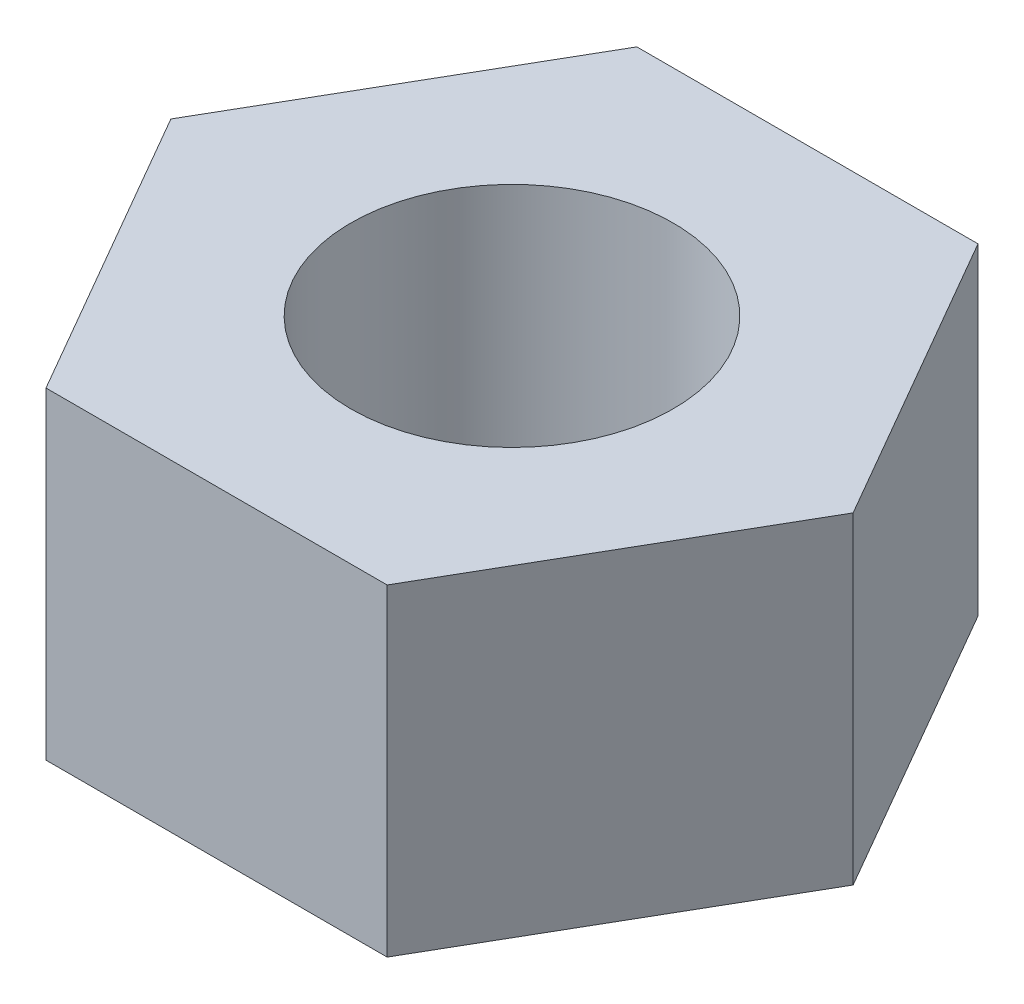
ISO-10303-21;
HEADER;
FILE_DESCRIPTION(('STEP AP214'),'2;1');
FILE_NAME('part.step','',(''),(''),'','','');
FILE_SCHEMA(('AUTOMOTIVE_DESIGN { 1 0 10303 214 1 1 1 1 }'));
ENDSEC;
DATA;
#1=APPLICATION_CONTEXT('core data for automotive mechanical design processes');
#2=APPLICATION_PROTOCOL_DEFINITION('international standard','automotive_design',2000,#1);
#3=PRODUCT_CONTEXT('',#1,'mechanical');
#4=PRODUCT('Part','Part','',(#3));
#5=PRODUCT_RELATED_PRODUCT_CATEGORY('part','',(#4));
#6=PRODUCT_DEFINITION_FORMATION('','',#4);
#7=PRODUCT_DEFINITION_CONTEXT('part definition',#1,'design');
#8=PRODUCT_DEFINITION('design','',#6,#7);
#9=PRODUCT_DEFINITION_SHAPE('','',#8);
#10=(LENGTH_UNIT() NAMED_UNIT(*) SI_UNIT(.MILLI.,.METRE.));
#11=(NAMED_UNIT(*) PLANE_ANGLE_UNIT() SI_UNIT($,.RADIAN.));
#12=(NAMED_UNIT(*) SI_UNIT($,.STERADIAN.) SOLID_ANGLE_UNIT());
#13=UNCERTAINTY_MEASURE_WITH_UNIT(LENGTH_MEASURE(1.E-05),#10,'distance_accuracy_value','');
#14=(GEOMETRIC_REPRESENTATION_CONTEXT(3) GLOBAL_UNCERTAINTY_ASSIGNED_CONTEXT((#13)) GLOBAL_UNIT_ASSIGNED_CONTEXT((#10,
#11,#12)) REPRESENTATION_CONTEXT('',''));
#15=CARTESIAN_POINT('',(0.,0.,0.));
#16=DIRECTION('',(0.,0.,1.));
#17=DIRECTION('',(1.,0.,0.));
#18=AXIS2_PLACEMENT_3D('',#15,#16,#17);
#19=CARTESIAN_POINT('',(0.,3.,0.));
#20=DIRECTION('',(0.,1.,0.));
#21=DIRECTION('',(0.,0.,1.));
#22=AXIS2_PLACEMENT_3D('',#19,#20,#21);
#23=PLANE('',#22);
#24=DIRECTION('',(0.499999999999995,0.,-0.866025403784442));
#25=VECTOR('',#24,1.);
#26=CARTESIAN_POINT('',(1.5877132402715,3.,2.74999999999998));
#27=LINE('',#26,#25);
#28=CARTESIAN_POINT('',(1.5877132402715,3.,2.74999999999998));
#29=VERTEX_POINT('',#28);
#30=CARTESIAN_POINT('',(3.17542648054294,3.,0.));
#31=VERTEX_POINT('',#30);
#32=EDGE_CURVE('E130',#29,#31,#27,.T.);
#33=ORIENTED_EDGE('',*,*,#32,.T.);
#34=DIRECTION('',(-0.500000000000001,0.,-0.866025403784438));
#35=VECTOR('',#34,1.);
#36=CARTESIAN_POINT('',(3.17542648054294,3.,0.));
#37=LINE('',#36,#35);
#38=CARTESIAN_POINT('',(1.58771324027147,3.,-2.75000000000001));
#39=VERTEX_POINT('',#38);
#40=EDGE_CURVE('E88',#31,#39,#37,.T.);
#41=ORIENTED_EDGE('',*,*,#40,.T.);
#42=DIRECTION('',(-1.,0.,0.));
#43=VECTOR('',#42,1.);
#44=CARTESIAN_POINT('',(1.58771324027147,3.,-2.75000000000001));
#45=LINE('',#44,#43);
#46=CARTESIAN_POINT('',(-1.58771324027148,3.,-2.74999999999999));
#47=VERTEX_POINT('',#46);
#48=EDGE_CURVE('E101',#39,#47,#45,.T.);
#49=ORIENTED_EDGE('',*,*,#48,.T.);
#50=DIRECTION('',(-0.499999999999995,0.,0.866025403784441));
#51=VECTOR('',#50,1.);
#52=CARTESIAN_POINT('',(-1.58771324027148,3.,-2.74999999999999));
#53=LINE('',#52,#51);
#54=CARTESIAN_POINT('',(-3.17542648054294,3.,0.));
#55=VERTEX_POINT('',#54);
#56=EDGE_CURVE('E95',#47,#55,#53,.T.);
#57=ORIENTED_EDGE('',*,*,#56,.T.);
#58=DIRECTION('',(0.500000000000007,0.,0.866025403784435));
#59=VECTOR('',#58,1.);
#60=CARTESIAN_POINT('',(-3.17542648054294,3.,0.));
#61=LINE('',#60,#59);
#62=CARTESIAN_POINT('',(-1.58771324027145,3.,2.75000000000002));
#63=VERTEX_POINT('',#62);
#64=EDGE_CURVE('E99',#55,#63,#61,.T.);
#65=ORIENTED_EDGE('',*,*,#64,.T.);
#66=DIRECTION('',(1.,0.,0.));
#67=VECTOR('',#66,1.);
#68=CARTESIAN_POINT('',(-1.58771324027145,3.,2.75000000000002));
#69=LINE('',#68,#67);
#70=EDGE_CURVE('E51',#63,#29,#69,.T.);
#71=ORIENTED_EDGE('',*,*,#70,.T.);
#72=EDGE_LOOP('',(#33,#41,#49,#57,#65,#71));
#73=FACE_BOUND('',#72,.T.);
#74=CARTESIAN_POINT('',(0.,3.,0.));
#75=DIRECTION('',(0.,1.,0.));
#76=DIRECTION('',(0.,0.,1.));
#77=AXIS2_PLACEMENT_3D('',#74,#75,#76);
#78=CIRCLE('',#77,1.5);
#79=CARTESIAN_POINT('',(0.,3.,1.5));
#80=VERTEX_POINT('',#79);
#81=EDGE_CURVE('E123',#80,#80,#78,.T.);
#82=ORIENTED_EDGE('',*,*,#81,.F.);
#83=EDGE_LOOP('',(#82));
#84=FACE_BOUND('',#83,.T.);
#85=ADVANCED_FACE('F34',(#73,#84),#23,.T.);
#86=CARTESIAN_POINT('',(0.,0.,0.));
#87=DIRECTION('',(0.,1.,0.));
#88=DIRECTION('',(0.,0.,1.));
#89=AXIS2_PLACEMENT_3D('',#86,#87,#88);
#90=PLANE('',#89);
#91=DIRECTION('',(0.499999999999995,0.,-0.866025403784442));
#92=VECTOR('',#91,1.);
#93=CARTESIAN_POINT('',(1.5877132402715,0.,2.74999999999998));
#94=LINE('',#93,#92);
#95=CARTESIAN_POINT('',(1.5877132402715,0.,2.74999999999998));
#96=VERTEX_POINT('',#95);
#97=CARTESIAN_POINT('',(3.17542648054294,0.,0.));
#98=VERTEX_POINT('',#97);
#99=EDGE_CURVE('E119',#96,#98,#94,.T.);
#100=ORIENTED_EDGE('',*,*,#99,.F.);
#101=DIRECTION('',(1.,0.,0.));
#102=VECTOR('',#101,1.);
#103=CARTESIAN_POINT('',(-1.58771324027145,0.,2.75000000000002));
#104=LINE('',#103,#102);
#105=CARTESIAN_POINT('',(-1.58771324027145,0.,2.75000000000002));
#106=VERTEX_POINT('',#105);
#107=EDGE_CURVE('E80',#106,#96,#104,.T.);
#108=ORIENTED_EDGE('',*,*,#107,.F.);
#109=DIRECTION('',(0.500000000000007,0.,0.866025403784435));
#110=VECTOR('',#109,1.);
#111=CARTESIAN_POINT('',(-3.17542648054294,0.,0.));
#112=LINE('',#111,#110);
#113=CARTESIAN_POINT('',(-3.17542648054294,0.,0.));
#114=VERTEX_POINT('',#113);
#115=EDGE_CURVE('E74',#114,#106,#112,.T.);
#116=ORIENTED_EDGE('',*,*,#115,.F.);
#117=DIRECTION('',(-0.499999999999995,0.,0.866025403784441));
#118=VECTOR('',#117,1.);
#119=CARTESIAN_POINT('',(-1.58771324027148,0.,-2.74999999999999));
#120=LINE('',#119,#118);
#121=CARTESIAN_POINT('',(-1.58771324027148,0.,-2.74999999999999));
#122=VERTEX_POINT('',#121);
#123=EDGE_CURVE('E109',#122,#114,#120,.T.);
#124=ORIENTED_EDGE('',*,*,#123,.F.);
#125=DIRECTION('',(-1.,0.,0.));
#126=VECTOR('',#125,1.);
#127=CARTESIAN_POINT('',(1.58771324027147,0.,-2.75000000000001));
#128=LINE('',#127,#126);
#129=CARTESIAN_POINT('',(1.58771324027147,0.,-2.75000000000001));
#130=VERTEX_POINT('',#129);
#131=EDGE_CURVE('E125',#130,#122,#128,.T.);
#132=ORIENTED_EDGE('',*,*,#131,.F.);
#133=DIRECTION('',(-0.500000000000001,0.,-0.866025403784438));
#134=VECTOR('',#133,1.);
#135=CARTESIAN_POINT('',(3.17542648054294,0.,0.));
#136=LINE('',#135,#134);
#137=EDGE_CURVE('E122',#98,#130,#136,.T.);
#138=ORIENTED_EDGE('',*,*,#137,.F.);
#139=EDGE_LOOP('',(#100,#108,#116,#124,#132,#138));
#140=FACE_BOUND('',#139,.T.);
#141=CARTESIAN_POINT('',(0.,0.,0.));
#142=DIRECTION('',(0.,1.,0.));
#143=DIRECTION('',(0.,0.,1.));
#144=AXIS2_PLACEMENT_3D('',#141,#142,#143);
#145=CIRCLE('',#144,1.5);
#146=CARTESIAN_POINT('',(0.,0.,1.5));
#147=VERTEX_POINT('',#146);
#148=EDGE_CURVE('E223',#147,#147,#145,.T.);
#149=ORIENTED_EDGE('',*,*,#148,.T.);
#150=EDGE_LOOP('',(#149));
#151=FACE_BOUND('',#150,.T.);
#152=ADVANCED_FACE('F139',(#140,#151),#90,.F.);
#153=CARTESIAN_POINT('',(1.5877132402715,3.,2.74999999999998));
#154=DIRECTION('',(-0.866025403784441,0.,-0.499999999999995));
#155=DIRECTION('',(-0.499999999999995,0.,0.866025403784442));
#156=AXIS2_PLACEMENT_3D('',#153,#154,#155);
#157=PLANE('',#156);
#158=ORIENTED_EDGE('',*,*,#99,.T.);
#159=DIRECTION('',(0.,-1.,0.));
#160=VECTOR('',#159,1.);
#161=CARTESIAN_POINT('',(3.17542648054294,3.,0.));
#162=LINE('',#161,#160);
#163=EDGE_CURVE('E11',#31,#98,#162,.T.);
#164=ORIENTED_EDGE('',*,*,#163,.F.);
#165=ORIENTED_EDGE('',*,*,#32,.F.);
#166=DIRECTION('',(0.,-1.,0.));
#167=VECTOR('',#166,1.);
#168=CARTESIAN_POINT('',(1.5877132402715,3.,2.74999999999998));
#169=LINE('',#168,#167);
#170=EDGE_CURVE('E115',#29,#96,#169,.T.);
#171=ORIENTED_EDGE('',*,*,#170,.T.);
#172=EDGE_LOOP('',(#158,#164,#165,#171));
#173=FACE_BOUND('',#172,.T.);
#174=ADVANCED_FACE('F36',(#173),#157,.F.);
#175=CARTESIAN_POINT('',(3.17542648054294,3.,0.));
#176=DIRECTION('',(-0.866025403784438,0.,0.500000000000001));
#177=DIRECTION('',(0.500000000000001,0.,0.866025403784438));
#178=AXIS2_PLACEMENT_3D('',#175,#176,#177);
#179=PLANE('',#178);
#180=ORIENTED_EDGE('',*,*,#137,.T.);
#181=DIRECTION('',(0.,-1.,0.));
#182=VECTOR('',#181,1.);
#183=CARTESIAN_POINT('',(1.58771324027147,3.,-2.75000000000001));
#184=LINE('',#183,#182);
#185=EDGE_CURVE('E43',#39,#130,#184,.T.);
#186=ORIENTED_EDGE('',*,*,#185,.F.);
#187=ORIENTED_EDGE('',*,*,#40,.F.);
#188=ORIENTED_EDGE('',*,*,#163,.T.);
#189=EDGE_LOOP('',(#180,#186,#187,#188));
#190=FACE_BOUND('',#189,.T.);
#191=ADVANCED_FACE('F164',(#190),#179,.F.);
#192=CARTESIAN_POINT('',(1.58771324027147,3.,-2.75000000000001));
#193=DIRECTION('',(0.,0.,1.));
#194=DIRECTION('',(1.,0.,0.));
#195=AXIS2_PLACEMENT_3D('',#192,#193,#194);
#196=PLANE('',#195);
#197=ORIENTED_EDGE('',*,*,#131,.T.);
#198=DIRECTION('',(0.,-1.,0.));
#199=VECTOR('',#198,1.);
#200=CARTESIAN_POINT('',(-1.58771324027148,3.,-2.74999999999999));
#201=LINE('',#200,#199);
#202=EDGE_CURVE('E110',#47,#122,#201,.T.);
#203=ORIENTED_EDGE('',*,*,#202,.F.);
#204=ORIENTED_EDGE('',*,*,#48,.F.);
#205=ORIENTED_EDGE('',*,*,#185,.T.);
#206=EDGE_LOOP('',(#197,#203,#204,#205));
#207=FACE_BOUND('',#206,.T.);
#208=ADVANCED_FACE('F136',(#207),#196,.F.);
#209=CARTESIAN_POINT('',(-1.58771324027148,3.,-2.74999999999999));
#210=DIRECTION('',(0.866025403784441,0.,0.499999999999995));
#211=DIRECTION('',(0.499999999999995,0.,-0.866025403784442));
#212=AXIS2_PLACEMENT_3D('',#209,#210,#211);
#213=PLANE('',#212);
#214=ORIENTED_EDGE('',*,*,#123,.T.);
#215=DIRECTION('',(0.,-1.,0.));
#216=VECTOR('',#215,1.);
#217=CARTESIAN_POINT('',(-3.17542648054294,3.,0.));
#218=LINE('',#217,#216);
#219=EDGE_CURVE('E106',#55,#114,#218,.T.);
#220=ORIENTED_EDGE('',*,*,#219,.F.);
#221=ORIENTED_EDGE('',*,*,#56,.F.);
#222=ORIENTED_EDGE('',*,*,#202,.T.);
#223=EDGE_LOOP('',(#214,#220,#221,#222));
#224=FACE_BOUND('',#223,.T.);
#225=ADVANCED_FACE('F107',(#224),#213,.F.);
#226=CARTESIAN_POINT('',(-3.17542648054294,3.,0.));
#227=DIRECTION('',(0.866025403784435,0.,-0.500000000000007));
#228=DIRECTION('',(-0.500000000000007,0.,-0.866025403784435));
#229=AXIS2_PLACEMENT_3D('',#226,#227,#228);
#230=PLANE('',#229);
#231=ORIENTED_EDGE('',*,*,#115,.T.);
#232=DIRECTION('',(0.,-1.,0.));
#233=VECTOR('',#232,1.);
#234=CARTESIAN_POINT('',(-1.58771324027145,3.,2.75000000000002));
#235=LINE('',#234,#233);
#236=EDGE_CURVE('E111',#63,#106,#235,.T.);
#237=ORIENTED_EDGE('',*,*,#236,.F.);
#238=ORIENTED_EDGE('',*,*,#64,.F.);
#239=ORIENTED_EDGE('',*,*,#219,.T.);
#240=EDGE_LOOP('',(#231,#237,#238,#239));
#241=FACE_BOUND('',#240,.T.);
#242=ADVANCED_FACE('F113',(#241),#230,.F.);
#243=CARTESIAN_POINT('',(-1.58771324027145,3.,2.75000000000002));
#244=DIRECTION('',(0.,0.,-1.));
#245=DIRECTION('',(-1.,0.,0.));
#246=AXIS2_PLACEMENT_3D('',#243,#244,#245);
#247=PLANE('',#246);
#248=ORIENTED_EDGE('',*,*,#107,.T.);
#249=ORIENTED_EDGE('',*,*,#170,.F.);
#250=ORIENTED_EDGE('',*,*,#70,.F.);
#251=ORIENTED_EDGE('',*,*,#236,.T.);
#252=EDGE_LOOP('',(#248,#249,#250,#251));
#253=FACE_BOUND('',#252,.T.);
#254=ADVANCED_FACE('F144',(#253),#247,.F.);
#255=CARTESIAN_POINT('',(0.,3.,0.));
#256=DIRECTION('',(0.,-1.,0.));
#257=DIRECTION('',(0.,0.,-1.));
#258=AXIS2_PLACEMENT_3D('',#255,#256,#257);
#259=CYLINDRICAL_SURFACE('',#258,1.5);
#260=ORIENTED_EDGE('',*,*,#81,.T.);
#261=EDGE_LOOP('',(#260));
#262=FACE_BOUND('',#261,.T.);
#263=ORIENTED_EDGE('',*,*,#148,.F.);
#264=EDGE_LOOP('',(#263));
#265=FACE_BOUND('',#264,.T.);
#266=ADVANCED_FACE('F146',(#262,#265),#259,.F.);
#267=CLOSED_SHELL('',(#85,#152,#174,#191,#208,#225,#242,#254,#266));
#268=MANIFOLD_SOLID_BREP('B2',#267);
#269=ADVANCED_BREP_SHAPE_REPRESENTATION('',(#18,#268),#14);
#270=SHAPE_DEFINITION_REPRESENTATION(#9,#269);
ENDSEC;
END-ISO-10303-21;
